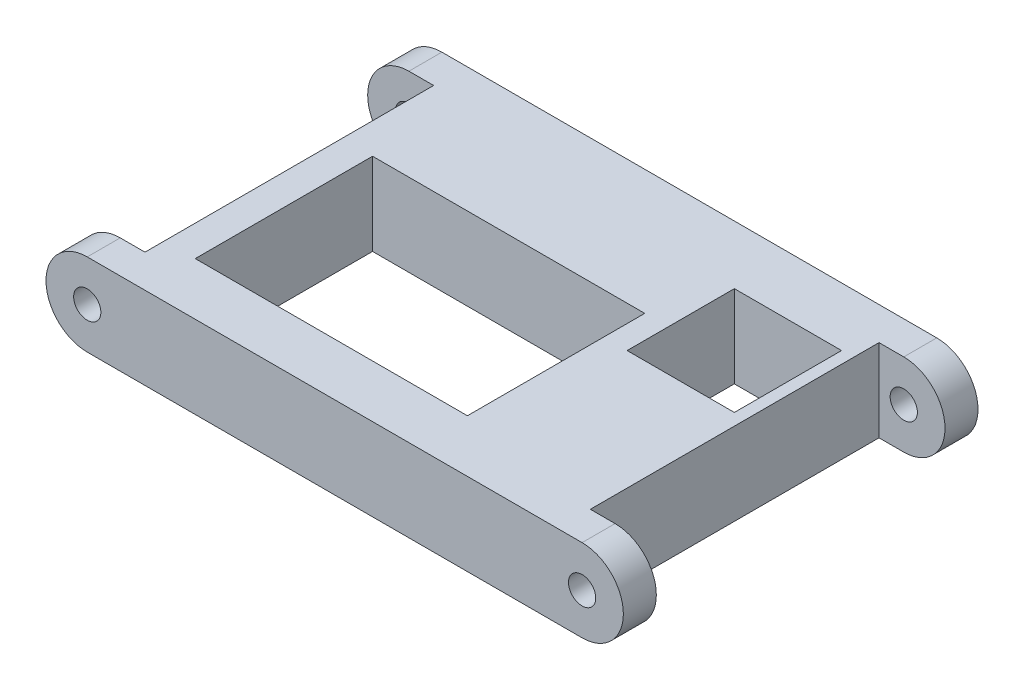
ISO-10303-21;
HEADER;
FILE_DESCRIPTION(('STEP AP214'),'2;1');
FILE_NAME('part.step','',(''),(''),'','','');
FILE_SCHEMA(('AUTOMOTIVE_DESIGN { 1 0 10303 214 1 1 1 1 }'));
ENDSEC;
DATA;
#1=APPLICATION_CONTEXT('core data for automotive mechanical design processes');
#2=APPLICATION_PROTOCOL_DEFINITION('international standard','automotive_design',2000,#1);
#3=PRODUCT_CONTEXT('',#1,'mechanical');
#4=PRODUCT('Part','Part','',(#3));
#5=PRODUCT_RELATED_PRODUCT_CATEGORY('part','',(#4));
#6=PRODUCT_DEFINITION_FORMATION('','',#4);
#7=PRODUCT_DEFINITION_CONTEXT('part definition',#1,'design');
#8=PRODUCT_DEFINITION('design','',#6,#7);
#9=PRODUCT_DEFINITION_SHAPE('','',#8);
#10=(LENGTH_UNIT() NAMED_UNIT(*) SI_UNIT(.MILLI.,.METRE.));
#11=(NAMED_UNIT(*) PLANE_ANGLE_UNIT() SI_UNIT($,.RADIAN.));
#12=(NAMED_UNIT(*) SI_UNIT($,.STERADIAN.) SOLID_ANGLE_UNIT());
#13=UNCERTAINTY_MEASURE_WITH_UNIT(LENGTH_MEASURE(1.E-05),#10,'distance_accuracy_value','');
#14=(GEOMETRIC_REPRESENTATION_CONTEXT(3) GLOBAL_UNCERTAINTY_ASSIGNED_CONTEXT((#13)) GLOBAL_UNIT_ASSIGNED_CONTEXT((#10,
#11,#12)) REPRESENTATION_CONTEXT('',''));
#15=CARTESIAN_POINT('',(0.,0.,0.));
#16=DIRECTION('',(0.,0.,1.));
#17=DIRECTION('',(1.,0.,0.));
#18=AXIS2_PLACEMENT_3D('',#15,#16,#17);
#19=CARTESIAN_POINT('',(0.,0.,4.));
#20=DIRECTION('',(0.,0.,1.));
#21=DIRECTION('',(1.,0.,0.));
#22=AXIS2_PLACEMENT_3D('',#19,#20,#21);
#23=PLANE('',#22);
#24=CARTESIAN_POINT('',(60.,0.,4.));
#25=DIRECTION('',(0.,0.,1.));
#26=DIRECTION('',(1.,0.,0.));
#27=AXIS2_PLACEMENT_3D('',#24,#25,#26);
#28=CIRCLE('',#27,1.65);
#29=CARTESIAN_POINT('',(61.65,0.,4.));
#30=VERTEX_POINT('',#29);
#31=EDGE_CURVE('E332',#30,#30,#28,.T.);
#32=ORIENTED_EDGE('',*,*,#31,.F.);
#33=EDGE_LOOP('',(#32));
#34=FACE_BOUND('',#33,.T.);
#35=DIRECTION('',(1.,0.,0.));
#36=VECTOR('',#35,1.);
#37=CARTESIAN_POINT('',(0.,5.,4.));
#38=LINE('',#37,#36);
#39=CARTESIAN_POINT('',(57.,5.,4.));
#40=VERTEX_POINT('',#39);
#41=CARTESIAN_POINT('',(60.,5.,4.));
#42=VERTEX_POINT('',#41);
#43=EDGE_CURVE('E322',#40,#42,#38,.T.);
#44=ORIENTED_EDGE('',*,*,#43,.F.);
#45=DIRECTION('',(0.,-1.,0.));
#46=VECTOR('',#45,1.);
#47=CARTESIAN_POINT('',(57.,5.,4.));
#48=LINE('',#47,#46);
#49=CARTESIAN_POINT('',(57.,-5.,4.));
#50=VERTEX_POINT('',#49);
#51=EDGE_CURVE('E300',#40,#50,#48,.T.);
#52=ORIENTED_EDGE('',*,*,#51,.T.);
#53=DIRECTION('',(-1.,0.,0.));
#54=VECTOR('',#53,1.);
#55=CARTESIAN_POINT('',(0.,-5.,4.));
#56=LINE('',#55,#54);
#57=CARTESIAN_POINT('',(60.,-5.,4.));
#58=VERTEX_POINT('',#57);
#59=EDGE_CURVE('E315',#58,#50,#56,.T.);
#60=ORIENTED_EDGE('',*,*,#59,.F.);
#61=CARTESIAN_POINT('',(60.,0.,4.));
#62=DIRECTION('',(0.,0.,1.));
#63=DIRECTION('',(1.,0.,0.));
#64=AXIS2_PLACEMENT_3D('',#61,#62,#63);
#65=CIRCLE('',#64,5.);
#66=EDGE_CURVE('E318',#58,#42,#65,.T.);
#67=ORIENTED_EDGE('',*,*,#66,.T.);
#68=EDGE_LOOP('',(#44,#52,#60,#67));
#69=FACE_BOUND('',#68,.T.);
#70=ADVANCED_FACE('F37',(#34,#69),#23,.T.);
#71=CARTESIAN_POINT('',(0.,-5.,4.));
#72=DIRECTION('',(0.,-1.,0.));
#73=DIRECTION('',(0.,0.,-1.));
#74=AXIS2_PLACEMENT_3D('',#71,#72,#73);
#75=PLANE('',#74);
#76=DIRECTION('',(1.,0.,0.));
#77=VECTOR('',#76,1.);
#78=CARTESIAN_POINT('',(0.,-5.,15.1304503670145));
#79=LINE('',#78,#77);
#80=CARTESIAN_POINT('',(6.72521855184716,-5.,15.1304503670145));
#81=VERTEX_POINT('',#80);
#82=CARTESIAN_POINT('',(39.7252185518472,-5.,15.1304503670145));
#83=VERTEX_POINT('',#82);
#84=EDGE_CURVE('E188',#81,#83,#79,.T.);
#85=ORIENTED_EDGE('',*,*,#84,.F.);
#86=DIRECTION('',(0.,0.,-1.));
#87=VECTOR('',#86,1.);
#88=CARTESIAN_POINT('',(6.72521855184716,-5.,4.));
#89=LINE('',#88,#87);
#90=CARTESIAN_POINT('',(6.72521855184716,-5.,36.6304503670145));
#91=VERTEX_POINT('',#90);
#92=EDGE_CURVE('E241',#91,#81,#89,.T.);
#93=ORIENTED_EDGE('',*,*,#92,.F.);
#94=DIRECTION('',(1.,0.,0.));
#95=VECTOR('',#94,1.);
#96=CARTESIAN_POINT('',(0.,-5.,36.6304503670145));
#97=LINE('',#96,#95);
#98=CARTESIAN_POINT('',(39.7252185518472,-5.,36.6304503670145));
#99=VERTEX_POINT('',#98);
#100=EDGE_CURVE('E238',#91,#99,#97,.T.);
#101=ORIENTED_EDGE('',*,*,#100,.T.);
#102=DIRECTION('',(0.,0.,-1.));
#103=VECTOR('',#102,1.);
#104=CARTESIAN_POINT('',(39.7252185518472,-5.,4.));
#105=LINE('',#104,#103);
#106=EDGE_CURVE('E236',#99,#83,#105,.T.);
#107=ORIENTED_EDGE('',*,*,#106,.T.);
#108=EDGE_LOOP('',(#85,#93,#101,#107));
#109=FACE_BOUND('',#108,.T.);
#110=DIRECTION('',(1.,0.,0.));
#111=VECTOR('',#110,1.);
#112=CARTESIAN_POINT('',(0.,-5.,7.10244119957082));
#113=LINE('',#112,#111);
#114=CARTESIAN_POINT('',(42.5609121056007,-5.,7.10244119957082));
#115=VERTEX_POINT('',#114);
#116=CARTESIAN_POINT('',(55.5609121056007,-5.,7.10244119957082));
#117=VERTEX_POINT('',#116);
#118=EDGE_CURVE('E234',#115,#117,#113,.T.);
#119=ORIENTED_EDGE('',*,*,#118,.F.);
#120=DIRECTION('',(0.,0.,-1.));
#121=VECTOR('',#120,1.);
#122=CARTESIAN_POINT('',(42.5609121056007,-5.,4.00000000000002));
#123=LINE('',#122,#121);
#124=CARTESIAN_POINT('',(42.5609121056006,-5.,20.1024411995708));
#125=VERTEX_POINT('',#124);
#126=EDGE_CURVE('E232',#125,#115,#123,.T.);
#127=ORIENTED_EDGE('',*,*,#126,.F.);
#128=DIRECTION('',(1.,0.,0.));
#129=VECTOR('',#128,1.);
#130=CARTESIAN_POINT('',(0.,-5.,20.1024411995708));
#131=LINE('',#130,#129);
#132=CARTESIAN_POINT('',(55.5609121056007,-5.,20.1024411995708));
#133=VERTEX_POINT('',#132);
#134=EDGE_CURVE('E229',#125,#133,#131,.T.);
#135=ORIENTED_EDGE('',*,*,#134,.T.);
#136=DIRECTION('',(0.,0.,-1.));
#137=VECTOR('',#136,1.);
#138=CARTESIAN_POINT('',(55.5609121056007,-5.,4.));
#139=LINE('',#138,#137);
#140=EDGE_CURVE('E205',#133,#117,#139,.T.);
#141=ORIENTED_EDGE('',*,*,#140,.T.);
#142=EDGE_LOOP('',(#119,#127,#135,#141));
#143=FACE_BOUND('',#142,.T.);
#144=DIRECTION('',(-1.,0.,0.));
#145=VECTOR('',#144,1.);
#146=CARTESIAN_POINT('',(0.,-5.,0.));
#147=LINE('',#146,#145);
#148=CARTESIAN_POINT('',(60.,-5.,0.));
#149=VERTEX_POINT('',#148);
#150=CARTESIAN_POINT('',(0.,-5.,0.));
#151=VERTEX_POINT('',#150);
#152=EDGE_CURVE('E314',#149,#151,#147,.T.);
#153=ORIENTED_EDGE('',*,*,#152,.F.);
#154=DIRECTION('',(0.,0.,-1.));
#155=VECTOR('',#154,1.);
#156=CARTESIAN_POINT('',(60.,-5.,4.));
#157=LINE('',#156,#155);
#158=EDGE_CURVE('E11',#58,#149,#157,.T.);
#159=ORIENTED_EDGE('',*,*,#158,.F.);
#160=ORIENTED_EDGE('',*,*,#59,.T.);
#161=DIRECTION('',(0.,0.,-1.));
#162=VECTOR('',#161,1.);
#163=CARTESIAN_POINT('',(57.,-5.,21.5));
#164=LINE('',#163,#162);
#165=CARTESIAN_POINT('',(57.,-5.,39.));
#166=VERTEX_POINT('',#165);
#167=EDGE_CURVE('E305',#166,#50,#164,.T.);
#168=ORIENTED_EDGE('',*,*,#167,.F.);
#169=DIRECTION('',(-1.,0.,0.));
#170=VECTOR('',#169,1.);
#171=CARTESIAN_POINT('',(0.,-5.,39.));
#172=LINE('',#171,#170);
#173=CARTESIAN_POINT('',(60.,-5.,39.));
#174=VERTEX_POINT('',#173);
#175=EDGE_CURVE('E251',#174,#166,#172,.T.);
#176=ORIENTED_EDGE('',*,*,#175,.F.);
#177=DIRECTION('',(0.,0.,1.));
#178=VECTOR('',#177,1.);
#179=CARTESIAN_POINT('',(60.,-5.,39.));
#180=LINE('',#179,#178);
#181=CARTESIAN_POINT('',(60.,-5.,43.));
#182=VERTEX_POINT('',#181);
#183=EDGE_CURVE('E294',#174,#182,#180,.T.);
#184=ORIENTED_EDGE('',*,*,#183,.T.);
#185=DIRECTION('',(-1.,0.,0.));
#186=VECTOR('',#185,1.);
#187=CARTESIAN_POINT('',(0.,-5.,43.));
#188=LINE('',#187,#186);
#189=CARTESIAN_POINT('',(0.,-5.,43.));
#190=VERTEX_POINT('',#189);
#191=EDGE_CURVE('E250',#182,#190,#188,.T.);
#192=ORIENTED_EDGE('',*,*,#191,.T.);
#193=DIRECTION('',(0.,0.,1.));
#194=VECTOR('',#193,1.);
#195=CARTESIAN_POINT('',(0.,-5.,39.));
#196=LINE('',#195,#194);
#197=CARTESIAN_POINT('',(0.,-5.,39.));
#198=VERTEX_POINT('',#197);
#199=EDGE_CURVE('E270',#198,#190,#196,.T.);
#200=ORIENTED_EDGE('',*,*,#199,.F.);
#201=CARTESIAN_POINT('',(2.99999999999999,-5.,39.));
#202=VERTEX_POINT('',#201);
#203=EDGE_CURVE('E255',#202,#198,#172,.T.);
#204=ORIENTED_EDGE('',*,*,#203,.F.);
#205=DIRECTION('',(0.,0.,-1.));
#206=VECTOR('',#205,1.);
#207=CARTESIAN_POINT('',(2.99999999999999,-5.,21.5));
#208=LINE('',#207,#206);
#209=CARTESIAN_POINT('',(2.99999999999999,-5.,4.));
#210=VERTEX_POINT('',#209);
#211=EDGE_CURVE('E308',#202,#210,#208,.T.);
#212=ORIENTED_EDGE('',*,*,#211,.T.);
#213=CARTESIAN_POINT('',(0.,-5.,4.));
#214=VERTEX_POINT('',#213);
#215=EDGE_CURVE('E319',#210,#214,#56,.T.);
#216=ORIENTED_EDGE('',*,*,#215,.T.);
#217=DIRECTION('',(0.,0.,-1.));
#218=VECTOR('',#217,1.);
#219=CARTESIAN_POINT('',(0.,-5.,4.));
#220=LINE('',#219,#218);
#221=EDGE_CURVE('E335',#214,#151,#220,.T.);
#222=ORIENTED_EDGE('',*,*,#221,.T.);
#223=EDGE_LOOP('',(#153,#159,#160,#168,#176,#184,#192,#200,#204,#212,#216,#222));
#224=FACE_BOUND('',#223,.T.);
#225=ADVANCED_FACE('F39',(#109,#143,#224),#75,.T.);
#226=CARTESIAN_POINT('',(60.,0.,4.));
#227=DIRECTION('',(0.,0.,-1.));
#228=DIRECTION('',(-1.,0.,0.));
#229=AXIS2_PLACEMENT_3D('',#226,#227,#228);
#230=CYLINDRICAL_SURFACE('',#229,5.);
#231=CARTESIAN_POINT('',(60.,0.,0.));
#232=DIRECTION('',(0.,0.,1.));
#233=DIRECTION('',(1.,0.,0.));
#234=AXIS2_PLACEMENT_3D('',#231,#232,#233);
#235=CIRCLE('',#234,5.);
#236=CARTESIAN_POINT('',(60.,5.,0.));
#237=VERTEX_POINT('',#236);
#238=EDGE_CURVE('E338',#149,#237,#235,.T.);
#239=ORIENTED_EDGE('',*,*,#238,.T.);
#240=DIRECTION('',(0.,0.,-1.));
#241=VECTOR('',#240,1.);
#242=CARTESIAN_POINT('',(60.,5.,4.));
#243=LINE('',#242,#241);
#244=EDGE_CURVE('E45',#42,#237,#243,.T.);
#245=ORIENTED_EDGE('',*,*,#244,.F.);
#246=ORIENTED_EDGE('',*,*,#66,.F.);
#247=ORIENTED_EDGE('',*,*,#158,.T.);
#248=EDGE_LOOP('',(#239,#245,#246,#247));
#249=FACE_BOUND('',#248,.T.);
#250=ADVANCED_FACE('F361',(#249),#230,.T.);
#251=CARTESIAN_POINT('',(0.,5.,4.));
#252=DIRECTION('',(0.,1.,0.));
#253=DIRECTION('',(0.,0.,1.));
#254=AXIS2_PLACEMENT_3D('',#251,#252,#253);
#255=PLANE('',#254);
#256=DIRECTION('',(1.,0.,0.));
#257=VECTOR('',#256,1.);
#258=CARTESIAN_POINT('',(6.72521855184716,5.,15.1304503670145));
#259=LINE('',#258,#257);
#260=CARTESIAN_POINT('',(6.72521855184716,5.,15.1304503670145));
#261=VERTEX_POINT('',#260);
#262=CARTESIAN_POINT('',(39.7252185518472,5.,15.1304503670145));
#263=VERTEX_POINT('',#262);
#264=EDGE_CURVE('E180',#261,#263,#259,.T.);
#265=ORIENTED_EDGE('',*,*,#264,.T.);
#266=DIRECTION('',(0.,0.,-1.));
#267=VECTOR('',#266,1.);
#268=CARTESIAN_POINT('',(39.7252185518472,5.,36.6304503670145));
#269=LINE('',#268,#267);
#270=CARTESIAN_POINT('',(39.7252185518472,5.,36.6304503670145));
#271=VERTEX_POINT('',#270);
#272=EDGE_CURVE('E171',#271,#263,#269,.T.);
#273=ORIENTED_EDGE('',*,*,#272,.F.);
#274=DIRECTION('',(1.,0.,0.));
#275=VECTOR('',#274,1.);
#276=CARTESIAN_POINT('',(6.72521855184716,5.,36.6304503670145));
#277=LINE('',#276,#275);
#278=CARTESIAN_POINT('',(6.72521855184716,5.,36.6304503670145));
#279=VERTEX_POINT('',#278);
#280=EDGE_CURVE('E179',#279,#271,#277,.T.);
#281=ORIENTED_EDGE('',*,*,#280,.F.);
#282=DIRECTION('',(0.,0.,-1.));
#283=VECTOR('',#282,1.);
#284=CARTESIAN_POINT('',(6.72521855184716,5.,36.6304503670145));
#285=LINE('',#284,#283);
#286=EDGE_CURVE('E190',#279,#261,#285,.T.);
#287=ORIENTED_EDGE('',*,*,#286,.T.);
#288=EDGE_LOOP('',(#265,#273,#281,#287));
#289=FACE_BOUND('',#288,.T.);
#290=DIRECTION('',(1.,0.,0.));
#291=VECTOR('',#290,1.);
#292=CARTESIAN_POINT('',(42.5609121056007,5.,7.10244119957082));
#293=LINE('',#292,#291);
#294=CARTESIAN_POINT('',(42.5609121056007,5.,7.10244119957082));
#295=VERTEX_POINT('',#294);
#296=CARTESIAN_POINT('',(55.5609121056007,5.,7.10244119957082));
#297=VERTEX_POINT('',#296);
#298=EDGE_CURVE('E195',#295,#297,#293,.T.);
#299=ORIENTED_EDGE('',*,*,#298,.T.);
#300=DIRECTION('',(0.,0.,-1.));
#301=VECTOR('',#300,1.);
#302=CARTESIAN_POINT('',(55.5609121056007,5.,20.1024411995708));
#303=LINE('',#302,#301);
#304=CARTESIAN_POINT('',(55.5609121056007,5.,20.1024411995708));
#305=VERTEX_POINT('',#304);
#306=EDGE_CURVE('E198',#305,#297,#303,.T.);
#307=ORIENTED_EDGE('',*,*,#306,.F.);
#308=DIRECTION('',(1.,0.,0.));
#309=VECTOR('',#308,1.);
#310=CARTESIAN_POINT('',(42.5609121056006,5.,20.1024411995708));
#311=LINE('',#310,#309);
#312=CARTESIAN_POINT('',(42.5609121056006,5.,20.1024411995708));
#313=VERTEX_POINT('',#312);
#314=EDGE_CURVE('E223',#313,#305,#311,.T.);
#315=ORIENTED_EDGE('',*,*,#314,.F.);
#316=DIRECTION('',(0.,0.,-1.));
#317=VECTOR('',#316,1.);
#318=CARTESIAN_POINT('',(42.5609121056006,5.,20.1024411995708));
#319=LINE('',#318,#317);
#320=EDGE_CURVE('E211',#313,#295,#319,.T.);
#321=ORIENTED_EDGE('',*,*,#320,.T.);
#322=EDGE_LOOP('',(#299,#307,#315,#321));
#323=FACE_BOUND('',#322,.T.);
#324=DIRECTION('',(1.,0.,0.));
#325=VECTOR('',#324,1.);
#326=CARTESIAN_POINT('',(0.,5.,0.));
#327=LINE('',#326,#325);
#328=CARTESIAN_POINT('',(0.,5.,0.));
#329=VERTEX_POINT('',#328);
#330=EDGE_CURVE('E341',#329,#237,#327,.T.);
#331=ORIENTED_EDGE('',*,*,#330,.F.);
#332=DIRECTION('',(0.,0.,-1.));
#333=VECTOR('',#332,1.);
#334=CARTESIAN_POINT('',(0.,5.,4.));
#335=LINE('',#334,#333);
#336=CARTESIAN_POINT('',(0.,5.,4.));
#337=VERTEX_POINT('',#336);
#338=EDGE_CURVE('E354',#337,#329,#335,.T.);
#339=ORIENTED_EDGE('',*,*,#338,.F.);
#340=CARTESIAN_POINT('',(2.99999999999999,5.,4.));
#341=VERTEX_POINT('',#340);
#342=EDGE_CURVE('E323',#337,#341,#38,.T.);
#343=ORIENTED_EDGE('',*,*,#342,.T.);
#344=DIRECTION('',(0.,0.,-1.));
#345=VECTOR('',#344,1.);
#346=CARTESIAN_POINT('',(3.,5.,21.5));
#347=LINE('',#346,#345);
#348=CARTESIAN_POINT('',(2.99999999999999,5.,39.));
#349=VERTEX_POINT('',#348);
#350=EDGE_CURVE('E311',#349,#341,#347,.T.);
#351=ORIENTED_EDGE('',*,*,#350,.F.);
#352=DIRECTION('',(1.,0.,0.));
#353=VECTOR('',#352,1.);
#354=CARTESIAN_POINT('',(0.,5.,39.));
#355=LINE('',#354,#353);
#356=CARTESIAN_POINT('',(0.,5.,39.));
#357=VERTEX_POINT('',#356);
#358=EDGE_CURVE('E259',#357,#349,#355,.T.);
#359=ORIENTED_EDGE('',*,*,#358,.F.);
#360=DIRECTION('',(0.,0.,1.));
#361=VECTOR('',#360,1.);
#362=CARTESIAN_POINT('',(0.,5.,39.));
#363=LINE('',#362,#361);
#364=CARTESIAN_POINT('',(0.,5.,43.));
#365=VERTEX_POINT('',#364);
#366=EDGE_CURVE('E288',#357,#365,#363,.T.);
#367=ORIENTED_EDGE('',*,*,#366,.T.);
#368=DIRECTION('',(1.,0.,0.));
#369=VECTOR('',#368,1.);
#370=CARTESIAN_POINT('',(0.,5.,43.));
#371=LINE('',#370,#369);
#372=CARTESIAN_POINT('',(60.,5.,43.));
#373=VERTEX_POINT('',#372);
#374=EDGE_CURVE('E276',#365,#373,#371,.T.);
#375=ORIENTED_EDGE('',*,*,#374,.T.);
#376=DIRECTION('',(0.,0.,1.));
#377=VECTOR('',#376,1.);
#378=CARTESIAN_POINT('',(60.,5.,39.));
#379=LINE('',#378,#377);
#380=CARTESIAN_POINT('',(60.,5.,39.));
#381=VERTEX_POINT('',#380);
#382=EDGE_CURVE('E291',#381,#373,#379,.T.);
#383=ORIENTED_EDGE('',*,*,#382,.F.);
#384=CARTESIAN_POINT('',(57.,5.,39.));
#385=VERTEX_POINT('',#384);
#386=EDGE_CURVE('E258',#385,#381,#355,.T.);
#387=ORIENTED_EDGE('',*,*,#386,.F.);
#388=DIRECTION('',(0.,0.,-1.));
#389=VECTOR('',#388,1.);
#390=CARTESIAN_POINT('',(57.,5.,21.5));
#391=LINE('',#390,#389);
#392=EDGE_CURVE('E302',#385,#40,#391,.T.);
#393=ORIENTED_EDGE('',*,*,#392,.T.);
#394=ORIENTED_EDGE('',*,*,#43,.T.);
#395=ORIENTED_EDGE('',*,*,#244,.T.);
#396=EDGE_LOOP('',(#331,#339,#343,#351,#359,#367,#375,#383,#387,#393,#394,#395));
#397=FACE_BOUND('',#396,.T.);
#398=ADVANCED_FACE('F192',(#289,#323,#397),#255,.T.);
#399=CARTESIAN_POINT('',(0.,0.,4.));
#400=DIRECTION('',(0.,0.,-1.));
#401=DIRECTION('',(-1.,0.,0.));
#402=AXIS2_PLACEMENT_3D('',#399,#400,#401);
#403=CYLINDRICAL_SURFACE('',#402,1.65);
#404=CARTESIAN_POINT('',(0.,0.,4.));
#405=DIRECTION('',(0.,0.,1.));
#406=DIRECTION('',(1.,0.,0.));
#407=AXIS2_PLACEMENT_3D('',#404,#405,#406);
#408=CIRCLE('',#407,1.65);
#409=CARTESIAN_POINT('',(1.65,0.,4.));
#410=VERTEX_POINT('',#409);
#411=EDGE_CURVE('E329',#410,#410,#408,.T.);
#412=ORIENTED_EDGE('',*,*,#411,.T.);
#413=EDGE_LOOP('',(#412));
#414=FACE_BOUND('',#413,.T.);
#415=CARTESIAN_POINT('',(0.,0.,0.));
#416=DIRECTION('',(0.,0.,1.));
#417=DIRECTION('',(1.,0.,0.));
#418=AXIS2_PLACEMENT_3D('',#415,#416,#417);
#419=CIRCLE('',#418,1.65);
#420=CARTESIAN_POINT('',(1.65,0.,0.));
#421=VERTEX_POINT('',#420);
#422=EDGE_CURVE('E347',#421,#421,#419,.T.);
#423=ORIENTED_EDGE('',*,*,#422,.F.);
#424=EDGE_LOOP('',(#423));
#425=FACE_BOUND('',#424,.T.);
#426=ADVANCED_FACE('F412',(#414,#425),#403,.F.);
#427=CARTESIAN_POINT('',(0.,0.,4.));
#428=DIRECTION('',(0.,0.,-1.));
#429=DIRECTION('',(-1.,0.,0.));
#430=AXIS2_PLACEMENT_3D('',#427,#428,#429);
#431=CYLINDRICAL_SURFACE('',#430,5.);
#432=CARTESIAN_POINT('',(0.,0.,0.));
#433=DIRECTION('',(0.,0.,1.));
#434=DIRECTION('',(1.,0.,0.));
#435=AXIS2_PLACEMENT_3D('',#432,#433,#434);
#436=CIRCLE('',#435,5.);
#437=EDGE_CURVE('E344',#329,#151,#436,.T.);
#438=ORIENTED_EDGE('',*,*,#437,.T.);
#439=ORIENTED_EDGE('',*,*,#221,.F.);
#440=CARTESIAN_POINT('',(0.,0.,4.));
#441=DIRECTION('',(0.,0.,1.));
#442=DIRECTION('',(1.,0.,0.));
#443=AXIS2_PLACEMENT_3D('',#440,#441,#442);
#444=CIRCLE('',#443,5.);
#445=EDGE_CURVE('E326',#337,#214,#444,.T.);
#446=ORIENTED_EDGE('',*,*,#445,.F.);
#447=ORIENTED_EDGE('',*,*,#338,.T.);
#448=EDGE_LOOP('',(#438,#439,#446,#447));
#449=FACE_BOUND('',#448,.T.);
#450=ADVANCED_FACE('F369',(#449),#431,.T.);
#451=CARTESIAN_POINT('',(60.,0.,4.));
#452=DIRECTION('',(0.,0.,-1.));
#453=DIRECTION('',(-1.,0.,0.));
#454=AXIS2_PLACEMENT_3D('',#451,#452,#453);
#455=CYLINDRICAL_SURFACE('',#454,1.65);
#456=ORIENTED_EDGE('',*,*,#31,.T.);
#457=EDGE_LOOP('',(#456));
#458=FACE_BOUND('',#457,.T.);
#459=CARTESIAN_POINT('',(60.,0.,0.));
#460=DIRECTION('',(0.,0.,1.));
#461=DIRECTION('',(1.,0.,0.));
#462=AXIS2_PLACEMENT_3D('',#459,#460,#461);
#463=CIRCLE('',#462,1.65);
#464=CARTESIAN_POINT('',(61.65,0.,0.));
#465=VERTEX_POINT('',#464);
#466=EDGE_CURVE('E350',#465,#465,#463,.T.);
#467=ORIENTED_EDGE('',*,*,#466,.F.);
#468=EDGE_LOOP('',(#467));
#469=FACE_BOUND('',#468,.T.);
#470=ADVANCED_FACE('F408',(#458,#469),#455,.F.);
#471=DIRECTION('',(0.,-1.,0.));
#472=VECTOR('',#471,1.);
#473=CARTESIAN_POINT('',(3.,5.,4.));
#474=LINE('',#473,#472);
#475=EDGE_CURVE('E297',#341,#210,#474,.T.);
#476=ORIENTED_EDGE('',*,*,#475,.F.);
#477=ORIENTED_EDGE('',*,*,#342,.F.);
#478=ORIENTED_EDGE('',*,*,#445,.T.);
#479=ORIENTED_EDGE('',*,*,#215,.F.);
#480=EDGE_LOOP('',(#476,#477,#478,#479));
#481=FACE_BOUND('',#480,.T.);
#482=ORIENTED_EDGE('',*,*,#411,.F.);
#483=EDGE_LOOP('',(#482));
#484=FACE_BOUND('',#483,.T.);
#485=ADVANCED_FACE('F405',(#481,#484),#23,.T.);
#486=CARTESIAN_POINT('',(0.,0.,0.));
#487=DIRECTION('',(0.,0.,1.));
#488=DIRECTION('',(1.,0.,0.));
#489=AXIS2_PLACEMENT_3D('',#486,#487,#488);
#490=PLANE('',#489);
#491=ORIENTED_EDGE('',*,*,#152,.T.);
#492=ORIENTED_EDGE('',*,*,#437,.F.);
#493=ORIENTED_EDGE('',*,*,#330,.T.);
#494=ORIENTED_EDGE('',*,*,#238,.F.);
#495=EDGE_LOOP('',(#491,#492,#493,#494));
#496=FACE_BOUND('',#495,.T.);
#497=ORIENTED_EDGE('',*,*,#422,.T.);
#498=EDGE_LOOP('',(#497));
#499=FACE_BOUND('',#498,.T.);
#500=ORIENTED_EDGE('',*,*,#466,.T.);
#501=EDGE_LOOP('',(#500));
#502=FACE_BOUND('',#501,.T.);
#503=ADVANCED_FACE('F365',(#496,#499,#502),#490,.F.);
#504=CARTESIAN_POINT('',(3.,5.,21.5));
#505=DIRECTION('',(1.,0.,0.));
#506=DIRECTION('',(0.,1.,0.));
#507=AXIS2_PLACEMENT_3D('',#504,#505,#506);
#508=PLANE('',#507);
#509=ORIENTED_EDGE('',*,*,#475,.T.);
#510=ORIENTED_EDGE('',*,*,#211,.F.);
#511=DIRECTION('',(0.,-1.,0.));
#512=VECTOR('',#511,1.);
#513=CARTESIAN_POINT('',(3.,5.,39.));
#514=LINE('',#513,#512);
#515=EDGE_CURVE('E244',#349,#202,#514,.T.);
#516=ORIENTED_EDGE('',*,*,#515,.F.);
#517=ORIENTED_EDGE('',*,*,#350,.T.);
#518=EDGE_LOOP('',(#509,#510,#516,#517));
#519=FACE_BOUND('',#518,.T.);
#520=ADVANCED_FACE('F376',(#519),#508,.F.);
#521=CARTESIAN_POINT('',(57.,5.,21.5));
#522=DIRECTION('',(1.,0.,0.));
#523=DIRECTION('',(0.,0.,-1.));
#524=AXIS2_PLACEMENT_3D('',#521,#522,#523);
#525=PLANE('',#524);
#526=ORIENTED_EDGE('',*,*,#51,.F.);
#527=ORIENTED_EDGE('',*,*,#392,.F.);
#528=DIRECTION('',(0.,-1.,0.));
#529=VECTOR('',#528,1.);
#530=CARTESIAN_POINT('',(57.,5.,39.));
#531=LINE('',#530,#529);
#532=EDGE_CURVE('E247',#385,#166,#531,.T.);
#533=ORIENTED_EDGE('',*,*,#532,.T.);
#534=ORIENTED_EDGE('',*,*,#167,.T.);
#535=EDGE_LOOP('',(#526,#527,#533,#534));
#536=FACE_BOUND('',#535,.T.);
#537=ADVANCED_FACE('F402',(#536),#525,.T.);
#538=CARTESIAN_POINT('',(0.,0.,39.));
#539=DIRECTION('',(0.,0.,-1.));
#540=DIRECTION('',(1.,0.,0.));
#541=AXIS2_PLACEMENT_3D('',#538,#539,#540);
#542=PLANE('',#541);
#543=CARTESIAN_POINT('',(60.,0.,39.));
#544=DIRECTION('',(0.,0.,1.));
#545=DIRECTION('',(1.,0.,0.));
#546=AXIS2_PLACEMENT_3D('',#543,#544,#545);
#547=CIRCLE('',#546,1.65);
#548=CARTESIAN_POINT('',(61.65,0.,39.));
#549=VERTEX_POINT('',#548);
#550=EDGE_CURVE('E267',#549,#549,#547,.T.);
#551=ORIENTED_EDGE('',*,*,#550,.T.);
#552=EDGE_LOOP('',(#551));
#553=FACE_BOUND('',#552,.T.);
#554=ORIENTED_EDGE('',*,*,#386,.T.);
#555=CARTESIAN_POINT('',(60.,0.,39.));
#556=DIRECTION('',(0.,0.,1.));
#557=DIRECTION('',(1.,0.,0.));
#558=AXIS2_PLACEMENT_3D('',#555,#556,#557);
#559=CIRCLE('',#558,5.);
#560=EDGE_CURVE('E254',#174,#381,#559,.T.);
#561=ORIENTED_EDGE('',*,*,#560,.F.);
#562=ORIENTED_EDGE('',*,*,#175,.T.);
#563=ORIENTED_EDGE('',*,*,#532,.F.);
#564=EDGE_LOOP('',(#554,#561,#562,#563));
#565=FACE_BOUND('',#564,.T.);
#566=ADVANCED_FACE('F398',(#553,#565),#542,.T.);
#567=CARTESIAN_POINT('',(60.,0.,39.));
#568=DIRECTION('',(0.,0.,1.));
#569=DIRECTION('',(-1.,0.,0.));
#570=AXIS2_PLACEMENT_3D('',#567,#568,#569);
#571=CYLINDRICAL_SURFACE('',#570,5.);
#572=CARTESIAN_POINT('',(60.,0.,43.));
#573=DIRECTION('',(0.,0.,1.));
#574=DIRECTION('',(1.,0.,0.));
#575=AXIS2_PLACEMENT_3D('',#572,#573,#574);
#576=CIRCLE('',#575,5.);
#577=EDGE_CURVE('E273',#182,#373,#576,.T.);
#578=ORIENTED_EDGE('',*,*,#577,.F.);
#579=ORIENTED_EDGE('',*,*,#183,.F.);
#580=ORIENTED_EDGE('',*,*,#560,.T.);
#581=ORIENTED_EDGE('',*,*,#382,.T.);
#582=EDGE_LOOP('',(#578,#579,#580,#581));
#583=FACE_BOUND('',#582,.T.);
#584=ADVANCED_FACE('F390',(#583),#571,.T.);
#585=CARTESIAN_POINT('',(0.,0.,39.));
#586=DIRECTION('',(0.,0.,1.));
#587=DIRECTION('',(-1.,0.,0.));
#588=AXIS2_PLACEMENT_3D('',#585,#586,#587);
#589=CYLINDRICAL_SURFACE('',#588,1.65);
#590=CARTESIAN_POINT('',(0.,0.,39.));
#591=DIRECTION('',(0.,0.,1.));
#592=DIRECTION('',(1.,0.,0.));
#593=AXIS2_PLACEMENT_3D('',#590,#591,#592);
#594=CIRCLE('',#593,1.65);
#595=CARTESIAN_POINT('',(1.65,0.,39.));
#596=VERTEX_POINT('',#595);
#597=EDGE_CURVE('E264',#596,#596,#594,.T.);
#598=ORIENTED_EDGE('',*,*,#597,.F.);
#599=EDGE_LOOP('',(#598));
#600=FACE_BOUND('',#599,.T.);
#601=CARTESIAN_POINT('',(0.,0.,43.));
#602=DIRECTION('',(0.,0.,1.));
#603=DIRECTION('',(1.,0.,0.));
#604=AXIS2_PLACEMENT_3D('',#601,#602,#603);
#605=CIRCLE('',#604,1.65);
#606=CARTESIAN_POINT('',(1.65,0.,43.));
#607=VERTEX_POINT('',#606);
#608=EDGE_CURVE('E280',#607,#607,#605,.T.);
#609=ORIENTED_EDGE('',*,*,#608,.T.);
#610=EDGE_LOOP('',(#609));
#611=FACE_BOUND('',#610,.T.);
#612=ADVANCED_FACE('F443',(#600,#611),#589,.F.);
#613=CARTESIAN_POINT('',(0.,0.,39.));
#614=DIRECTION('',(0.,0.,1.));
#615=DIRECTION('',(-1.,0.,0.));
#616=AXIS2_PLACEMENT_3D('',#613,#614,#615);
#617=CYLINDRICAL_SURFACE('',#616,5.);
#618=CARTESIAN_POINT('',(0.,0.,43.));
#619=DIRECTION('',(0.,0.,1.));
#620=DIRECTION('',(1.,0.,0.));
#621=AXIS2_PLACEMENT_3D('',#618,#619,#620);
#622=CIRCLE('',#621,5.);
#623=EDGE_CURVE('E278',#365,#190,#622,.T.);
#624=ORIENTED_EDGE('',*,*,#623,.F.);
#625=ORIENTED_EDGE('',*,*,#366,.F.);
#626=CARTESIAN_POINT('',(0.,0.,39.));
#627=DIRECTION('',(0.,0.,1.));
#628=DIRECTION('',(1.,0.,0.));
#629=AXIS2_PLACEMENT_3D('',#626,#627,#628);
#630=CIRCLE('',#629,5.);
#631=EDGE_CURVE('E262',#357,#198,#630,.T.);
#632=ORIENTED_EDGE('',*,*,#631,.T.);
#633=ORIENTED_EDGE('',*,*,#199,.T.);
#634=EDGE_LOOP('',(#624,#625,#632,#633));
#635=FACE_BOUND('',#634,.T.);
#636=ADVANCED_FACE('F444',(#635),#617,.T.);
#637=CARTESIAN_POINT('',(60.,0.,39.));
#638=DIRECTION('',(0.,0.,1.));
#639=DIRECTION('',(-1.,0.,0.));
#640=AXIS2_PLACEMENT_3D('',#637,#638,#639);
#641=CYLINDRICAL_SURFACE('',#640,1.65);
#642=ORIENTED_EDGE('',*,*,#550,.F.);
#643=EDGE_LOOP('',(#642));
#644=FACE_BOUND('',#643,.T.);
#645=CARTESIAN_POINT('',(60.,0.,43.));
#646=DIRECTION('',(0.,0.,1.));
#647=DIRECTION('',(1.,0.,0.));
#648=AXIS2_PLACEMENT_3D('',#645,#646,#647);
#649=CIRCLE('',#648,1.65);
#650=CARTESIAN_POINT('',(61.65,0.,43.));
#651=VERTEX_POINT('',#650);
#652=EDGE_CURVE('E283',#651,#651,#649,.T.);
#653=ORIENTED_EDGE('',*,*,#652,.T.);
#654=EDGE_LOOP('',(#653));
#655=FACE_BOUND('',#654,.T.);
#656=ADVANCED_FACE('F447',(#644,#655),#641,.F.);
#657=ORIENTED_EDGE('',*,*,#515,.T.);
#658=ORIENTED_EDGE('',*,*,#203,.T.);
#659=ORIENTED_EDGE('',*,*,#631,.F.);
#660=ORIENTED_EDGE('',*,*,#358,.T.);
#661=EDGE_LOOP('',(#657,#658,#659,#660));
#662=FACE_BOUND('',#661,.T.);
#663=ORIENTED_EDGE('',*,*,#597,.T.);
#664=EDGE_LOOP('',(#663));
#665=FACE_BOUND('',#664,.T.);
#666=ADVANCED_FACE('F380',(#662,#665),#542,.T.);
#667=CARTESIAN_POINT('',(0.,0.,43.));
#668=DIRECTION('',(0.,0.,-1.));
#669=DIRECTION('',(1.,0.,0.));
#670=AXIS2_PLACEMENT_3D('',#667,#668,#669);
#671=PLANE('',#670);
#672=ORIENTED_EDGE('',*,*,#191,.F.);
#673=ORIENTED_EDGE('',*,*,#577,.T.);
#674=ORIENTED_EDGE('',*,*,#374,.F.);
#675=ORIENTED_EDGE('',*,*,#623,.T.);
#676=EDGE_LOOP('',(#672,#673,#674,#675));
#677=FACE_BOUND('',#676,.T.);
#678=ORIENTED_EDGE('',*,*,#608,.F.);
#679=EDGE_LOOP('',(#678));
#680=FACE_BOUND('',#679,.T.);
#681=ORIENTED_EDGE('',*,*,#652,.F.);
#682=EDGE_LOOP('',(#681));
#683=FACE_BOUND('',#682,.T.);
#684=ADVANCED_FACE('F387',(#677,#680,#683),#671,.F.);
#685=CARTESIAN_POINT('',(42.5609121056007,5.,7.10244119957082));
#686=DIRECTION('',(0.,0.,-1.));
#687=DIRECTION('',(-1.,0.,0.));
#688=AXIS2_PLACEMENT_3D('',#685,#686,#687);
#689=PLANE('',#688);
#690=ORIENTED_EDGE('',*,*,#118,.T.);
#691=DIRECTION('',(0.,-1.,0.));
#692=VECTOR('',#691,1.);
#693=CARTESIAN_POINT('',(55.5609121056007,5.,7.10244119957082));
#694=LINE('',#693,#692);
#695=EDGE_CURVE('E60',#297,#117,#694,.T.);
#696=ORIENTED_EDGE('',*,*,#695,.F.);
#697=ORIENTED_EDGE('',*,*,#298,.F.);
#698=DIRECTION('',(0.,-1.,0.));
#699=VECTOR('',#698,1.);
#700=CARTESIAN_POINT('',(42.5609121056007,5.,7.10244119957082));
#701=LINE('',#700,#699);
#702=EDGE_CURVE('E218',#295,#115,#701,.T.);
#703=ORIENTED_EDGE('',*,*,#702,.T.);
#704=EDGE_LOOP('',(#690,#696,#697,#703));
#705=FACE_BOUND('',#704,.T.);
#706=ADVANCED_FACE('F456',(#705),#689,.F.);
#707=CARTESIAN_POINT('',(42.5609121056006,5.,20.1024411995708));
#708=DIRECTION('',(-1.,0.,0.));
#709=DIRECTION('',(0.,0.,1.));
#710=AXIS2_PLACEMENT_3D('',#707,#708,#709);
#711=PLANE('',#710);
#712=ORIENTED_EDGE('',*,*,#126,.T.);
#713=ORIENTED_EDGE('',*,*,#702,.F.);
#714=ORIENTED_EDGE('',*,*,#320,.F.);
#715=DIRECTION('',(0.,-1.,0.));
#716=VECTOR('',#715,1.);
#717=CARTESIAN_POINT('',(42.5609121056006,5.,20.1024411995708));
#718=LINE('',#717,#716);
#719=EDGE_CURVE('E215',#313,#125,#718,.T.);
#720=ORIENTED_EDGE('',*,*,#719,.T.);
#721=EDGE_LOOP('',(#712,#713,#714,#720));
#722=FACE_BOUND('',#721,.T.);
#723=ADVANCED_FACE('F459',(#722),#711,.F.);
#724=CARTESIAN_POINT('',(42.5609121056006,5.,20.1024411995708));
#725=DIRECTION('',(0.,0.,-1.));
#726=DIRECTION('',(-1.,0.,0.));
#727=AXIS2_PLACEMENT_3D('',#724,#725,#726);
#728=PLANE('',#727);
#729=ORIENTED_EDGE('',*,*,#719,.F.);
#730=ORIENTED_EDGE('',*,*,#314,.T.);
#731=DIRECTION('',(0.,-1.,0.));
#732=VECTOR('',#731,1.);
#733=CARTESIAN_POINT('',(55.5609121056007,5.,20.1024411995708));
#734=LINE('',#733,#732);
#735=EDGE_CURVE('E212',#305,#133,#734,.T.);
#736=ORIENTED_EDGE('',*,*,#735,.T.);
#737=ORIENTED_EDGE('',*,*,#134,.F.);
#738=EDGE_LOOP('',(#729,#730,#736,#737));
#739=FACE_BOUND('',#738,.T.);
#740=ADVANCED_FACE('F462',(#739),#728,.T.);
#741=CARTESIAN_POINT('',(55.5609121056007,5.,20.1024411995708));
#742=DIRECTION('',(-1.,0.,0.));
#743=DIRECTION('',(0.,0.,1.));
#744=AXIS2_PLACEMENT_3D('',#741,#742,#743);
#745=PLANE('',#744);
#746=ORIENTED_EDGE('',*,*,#735,.F.);
#747=ORIENTED_EDGE('',*,*,#306,.T.);
#748=ORIENTED_EDGE('',*,*,#695,.T.);
#749=ORIENTED_EDGE('',*,*,#140,.F.);
#750=EDGE_LOOP('',(#746,#747,#748,#749));
#751=FACE_BOUND('',#750,.T.);
#752=ADVANCED_FACE('F466',(#751),#745,.T.);
#753=CARTESIAN_POINT('',(6.72521855184716,5.,15.1304503670145));
#754=DIRECTION('',(0.,0.,-1.));
#755=DIRECTION('',(-1.,0.,0.));
#756=AXIS2_PLACEMENT_3D('',#753,#754,#755);
#757=PLANE('',#756);
#758=ORIENTED_EDGE('',*,*,#84,.T.);
#759=DIRECTION('',(0.,-1.,0.));
#760=VECTOR('',#759,1.);
#761=CARTESIAN_POINT('',(39.7252185518472,5.,15.1304503670145));
#762=LINE('',#761,#760);
#763=EDGE_CURVE('E52',#263,#83,#762,.T.);
#764=ORIENTED_EDGE('',*,*,#763,.F.);
#765=ORIENTED_EDGE('',*,*,#264,.F.);
#766=DIRECTION('',(0.,-1.,0.));
#767=VECTOR('',#766,1.);
#768=CARTESIAN_POINT('',(6.72521855184716,5.,15.1304503670145));
#769=LINE('',#768,#767);
#770=EDGE_CURVE('E203',#261,#81,#769,.T.);
#771=ORIENTED_EDGE('',*,*,#770,.T.);
#772=EDGE_LOOP('',(#758,#764,#765,#771));
#773=FACE_BOUND('',#772,.T.);
#774=ADVANCED_FACE('F184',(#773),#757,.F.);
#775=CARTESIAN_POINT('',(6.72521855184716,5.,36.6304503670145));
#776=DIRECTION('',(-1.,0.,0.));
#777=DIRECTION('',(0.,0.,1.));
#778=AXIS2_PLACEMENT_3D('',#775,#776,#777);
#779=PLANE('',#778);
#780=ORIENTED_EDGE('',*,*,#92,.T.);
#781=ORIENTED_EDGE('',*,*,#770,.F.);
#782=ORIENTED_EDGE('',*,*,#286,.F.);
#783=DIRECTION('',(0.,-1.,0.));
#784=VECTOR('',#783,1.);
#785=CARTESIAN_POINT('',(6.72521855184716,5.,36.6304503670145));
#786=LINE('',#785,#784);
#787=EDGE_CURVE('E206',#279,#91,#786,.T.);
#788=ORIENTED_EDGE('',*,*,#787,.T.);
#789=EDGE_LOOP('',(#780,#781,#782,#788));
#790=FACE_BOUND('',#789,.T.);
#791=ADVANCED_FACE('F475',(#790),#779,.F.);
#792=CARTESIAN_POINT('',(6.72521855184716,5.,36.6304503670145));
#793=DIRECTION('',(0.,0.,-1.));
#794=DIRECTION('',(-1.,0.,0.));
#795=AXIS2_PLACEMENT_3D('',#792,#793,#794);
#796=PLANE('',#795);
#797=ORIENTED_EDGE('',*,*,#787,.F.);
#798=ORIENTED_EDGE('',*,*,#280,.T.);
#799=DIRECTION('',(0.,-1.,0.));
#800=VECTOR('',#799,1.);
#801=CARTESIAN_POINT('',(39.7252185518472,5.,36.6304503670145));
#802=LINE('',#801,#800);
#803=EDGE_CURVE('E174',#271,#99,#802,.T.);
#804=ORIENTED_EDGE('',*,*,#803,.T.);
#805=ORIENTED_EDGE('',*,*,#100,.F.);
#806=EDGE_LOOP('',(#797,#798,#804,#805));
#807=FACE_BOUND('',#806,.T.);
#808=ADVANCED_FACE('F478',(#807),#796,.T.);
#809=CARTESIAN_POINT('',(39.7252185518472,5.,36.6304503670145));
#810=DIRECTION('',(-1.,0.,0.));
#811=DIRECTION('',(0.,0.,1.));
#812=AXIS2_PLACEMENT_3D('',#809,#810,#811);
#813=PLANE('',#812);
#814=ORIENTED_EDGE('',*,*,#803,.F.);
#815=ORIENTED_EDGE('',*,*,#272,.T.);
#816=ORIENTED_EDGE('',*,*,#763,.T.);
#817=ORIENTED_EDGE('',*,*,#106,.F.);
#818=EDGE_LOOP('',(#814,#815,#816,#817));
#819=FACE_BOUND('',#818,.T.);
#820=ADVANCED_FACE('F172',(#819),#813,.T.);
#821=CLOSED_SHELL('',(#70,#225,#250,#398,#426,#450,#470,#485,#503,#520,#537,#566,#584,#612,#636,
#656,#666,#684,#706,#723,#740,#752,#774,#791,#808,#820));
#822=MANIFOLD_SOLID_BREP('B2',#821);
#823=ADVANCED_BREP_SHAPE_REPRESENTATION('',(#18,#822),#14);
#824=SHAPE_DEFINITION_REPRESENTATION(#9,#823);
ENDSEC;
END-ISO-10303-21;
